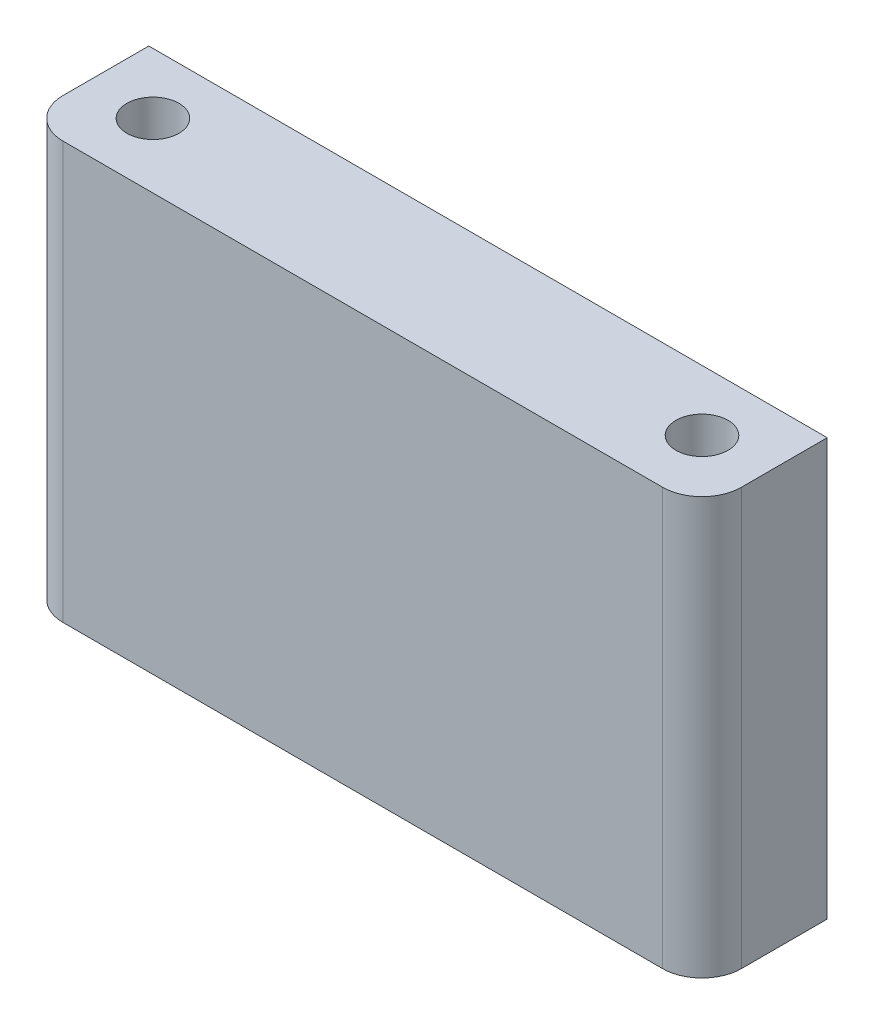
ISO-10303-21;
HEADER;
FILE_DESCRIPTION(('STEP AP214'),'2;1');
FILE_NAME('part.step','',(''),(''),'','','');
FILE_SCHEMA(('AUTOMOTIVE_DESIGN { 1 0 10303 214 1 1 1 1 }'));
ENDSEC;
DATA;
#1=APPLICATION_CONTEXT('core data for automotive mechanical design processes');
#2=APPLICATION_PROTOCOL_DEFINITION('international standard','automotive_design',2000,#1);
#3=PRODUCT_CONTEXT('',#1,'mechanical');
#4=PRODUCT('Part','Part','',(#3));
#5=PRODUCT_RELATED_PRODUCT_CATEGORY('part','',(#4));
#6=PRODUCT_DEFINITION_FORMATION('','',#4);
#7=PRODUCT_DEFINITION_CONTEXT('part definition',#1,'design');
#8=PRODUCT_DEFINITION('design','',#6,#7);
#9=PRODUCT_DEFINITION_SHAPE('','',#8);
#10=(LENGTH_UNIT() NAMED_UNIT(*) SI_UNIT(.MILLI.,.METRE.));
#11=(NAMED_UNIT(*) PLANE_ANGLE_UNIT() SI_UNIT($,.RADIAN.));
#12=(NAMED_UNIT(*) SI_UNIT($,.STERADIAN.) SOLID_ANGLE_UNIT());
#13=UNCERTAINTY_MEASURE_WITH_UNIT(LENGTH_MEASURE(1.E-05),#10,'distance_accuracy_value','');
#14=(GEOMETRIC_REPRESENTATION_CONTEXT(3) GLOBAL_UNCERTAINTY_ASSIGNED_CONTEXT((#13)) GLOBAL_UNIT_ASSIGNED_CONTEXT((#10,
#11,#12)) REPRESENTATION_CONTEXT('',''));
#15=CARTESIAN_POINT('',(0.,0.,0.));
#16=DIRECTION('',(0.,0.,1.));
#17=DIRECTION('',(1.,0.,0.));
#18=AXIS2_PLACEMENT_3D('',#15,#16,#17);
#19=CARTESIAN_POINT('',(0.,0.,35.0625));
#20=DIRECTION('',(0.,1.,0.));
#21=DIRECTION('',(1.,0.,0.));
#22=AXIS2_PLACEMENT_3D('',#19,#20,#21);
#23=PLANE('',#22);
#24=CARTESIAN_POINT('',(34.8,0.,34.8));
#25=DIRECTION('',(0.,-1.,0.));
#26=DIRECTION('',(1.,0.,0.));
#27=AXIS2_PLACEMENT_3D('',#24,#25,#26);
#28=CIRCLE('',#27,3.3);
#29=CARTESIAN_POINT('',(31.5,0.,34.8));
#30=VERTEX_POINT('',#29);
#31=EDGE_CURVE('E177',#30,#30,#28,.T.);
#32=ORIENTED_EDGE('',*,*,#31,.F.);
#33=EDGE_LOOP('',(#32));
#34=FACE_BOUND('',#33,.T.);
#35=CARTESIAN_POINT('',(-34.8,0.,34.8));
#36=DIRECTION('',(0.,-1.,0.));
#37=DIRECTION('',(1.,0.,0.));
#38=AXIS2_PLACEMENT_3D('',#35,#36,#37);
#39=CIRCLE('',#38,3.3);
#40=CARTESIAN_POINT('',(-38.1,0.,34.8));
#41=VERTEX_POINT('',#40);
#42=EDGE_CURVE('E194',#41,#41,#39,.T.);
#43=ORIENTED_EDGE('',*,*,#42,.F.);
#44=EDGE_LOOP('',(#43));
#45=FACE_BOUND('',#44,.T.);
#46=CARTESIAN_POINT('',(-38.,0.,38.));
#47=DIRECTION('',(0.,1.,0.));
#48=DIRECTION('',(-1.,0.,0.));
#49=AXIS2_PLACEMENT_3D('',#46,#47,#48);
#50=CIRCLE('',#49,5.);
#51=CARTESIAN_POINT('',(-43.,0.,38.));
#52=VERTEX_POINT('',#51);
#53=CARTESIAN_POINT('',(-38.,0.,43.));
#54=VERTEX_POINT('',#53);
#55=EDGE_CURVE('E30',#52,#54,#50,.T.);
#56=ORIENTED_EDGE('',*,*,#55,.F.);
#57=DIRECTION('',(0.,0.,-1.));
#58=VECTOR('',#57,1.);
#59=CARTESIAN_POINT('',(-43.,0.,38.));
#60=LINE('',#59,#58);
#61=CARTESIAN_POINT('',(-43.,0.,27.125));
#62=VERTEX_POINT('',#61);
#63=EDGE_CURVE('E193',#52,#62,#60,.T.);
#64=ORIENTED_EDGE('',*,*,#63,.T.);
#65=DIRECTION('',(1.,0.,0.));
#66=VECTOR('',#65,1.);
#67=CARTESIAN_POINT('',(24.4230296032249,0.,27.125));
#68=LINE('',#67,#66);
#69=CARTESIAN_POINT('',(43.,0.,27.125));
#70=VERTEX_POINT('',#69);
#71=EDGE_CURVE('E131',#62,#70,#68,.T.);
#72=ORIENTED_EDGE('',*,*,#71,.T.);
#73=DIRECTION('',(0.,0.,1.));
#74=VECTOR('',#73,1.);
#75=CARTESIAN_POINT('',(43.,0.,27.125));
#76=LINE('',#75,#74);
#77=CARTESIAN_POINT('',(43.,0.,38.));
#78=VERTEX_POINT('',#77);
#79=EDGE_CURVE('E111',#70,#78,#76,.T.);
#80=ORIENTED_EDGE('',*,*,#79,.T.);
#81=CARTESIAN_POINT('',(38.,0.,38.));
#82=DIRECTION('',(0.,1.,0.));
#83=DIRECTION('',(0.,0.,1.));
#84=AXIS2_PLACEMENT_3D('',#81,#82,#83);
#85=CIRCLE('',#84,5.);
#86=CARTESIAN_POINT('',(38.,0.,43.));
#87=VERTEX_POINT('',#86);
#88=EDGE_CURVE('E97',#87,#78,#85,.T.);
#89=ORIENTED_EDGE('',*,*,#88,.F.);
#90=DIRECTION('',(-1.,0.,0.));
#91=VECTOR('',#90,1.);
#92=CARTESIAN_POINT('',(38.,0.,43.));
#93=LINE('',#92,#91);
#94=EDGE_CURVE('E138',#87,#54,#93,.T.);
#95=ORIENTED_EDGE('',*,*,#94,.T.);
#96=EDGE_LOOP('',(#56,#64,#72,#80,#89,#95));
#97=FACE_BOUND('',#96,.T.);
#98=ADVANCED_FACE('F17',(#34,#45,#97),#23,.F.);
#99=CARTESIAN_POINT('',(0.,52.846,35.0625));
#100=DIRECTION('',(0.,1.,0.));
#101=DIRECTION('',(1.,0.,0.));
#102=AXIS2_PLACEMENT_3D('',#99,#100,#101);
#103=PLANE('',#102);
#104=CARTESIAN_POINT('',(34.8,52.846,34.8));
#105=DIRECTION('',(0.,-1.,0.));
#106=DIRECTION('',(1.,0.,0.));
#107=AXIS2_PLACEMENT_3D('',#104,#105,#106);
#108=CIRCLE('',#107,3.3);
#109=CARTESIAN_POINT('',(31.5,52.846,34.8));
#110=VERTEX_POINT('',#109);
#111=EDGE_CURVE('E171',#110,#110,#108,.T.);
#112=ORIENTED_EDGE('',*,*,#111,.T.);
#113=EDGE_LOOP('',(#112));
#114=FACE_BOUND('',#113,.T.);
#115=CARTESIAN_POINT('',(-34.8,52.846,34.8));
#116=DIRECTION('',(0.,-1.,0.));
#117=DIRECTION('',(1.,0.,0.));
#118=AXIS2_PLACEMENT_3D('',#115,#116,#117);
#119=CIRCLE('',#118,3.3);
#120=CARTESIAN_POINT('',(-38.1,52.846,34.8));
#121=VERTEX_POINT('',#120);
#122=EDGE_CURVE('E183',#121,#121,#119,.T.);
#123=ORIENTED_EDGE('',*,*,#122,.T.);
#124=EDGE_LOOP('',(#123));
#125=FACE_BOUND('',#124,.T.);
#126=CARTESIAN_POINT('',(-38.,52.846,38.));
#127=DIRECTION('',(0.,1.,0.));
#128=DIRECTION('',(-1.,0.,0.));
#129=AXIS2_PLACEMENT_3D('',#126,#127,#128);
#130=CIRCLE('',#129,5.);
#131=CARTESIAN_POINT('',(-43.,52.846,38.));
#132=VERTEX_POINT('',#131);
#133=CARTESIAN_POINT('',(-38.,52.846,43.));
#134=VERTEX_POINT('',#133);
#135=EDGE_CURVE('E11',#132,#134,#130,.T.);
#136=ORIENTED_EDGE('',*,*,#135,.T.);
#137=DIRECTION('',(1.,0.,0.));
#138=VECTOR('',#137,1.);
#139=CARTESIAN_POINT('',(38.,52.846,43.));
#140=LINE('',#139,#138);
#141=CARTESIAN_POINT('',(38.,52.846,43.));
#142=VERTEX_POINT('',#141);
#143=EDGE_CURVE('E91',#134,#142,#140,.T.);
#144=ORIENTED_EDGE('',*,*,#143,.T.);
#145=CARTESIAN_POINT('',(38.,52.846,38.));
#146=DIRECTION('',(0.,1.,0.));
#147=DIRECTION('',(0.,0.,1.));
#148=AXIS2_PLACEMENT_3D('',#145,#146,#147);
#149=CIRCLE('',#148,5.);
#150=CARTESIAN_POINT('',(43.,52.846,38.));
#151=VERTEX_POINT('',#150);
#152=EDGE_CURVE('E87',#142,#151,#149,.T.);
#153=ORIENTED_EDGE('',*,*,#152,.T.);
#154=DIRECTION('',(0.,0.,-1.));
#155=VECTOR('',#154,1.);
#156=CARTESIAN_POINT('',(43.,52.846,27.125));
#157=LINE('',#156,#155);
#158=CARTESIAN_POINT('',(43.,52.846,27.125));
#159=VERTEX_POINT('',#158);
#160=EDGE_CURVE('E89',#151,#159,#157,.T.);
#161=ORIENTED_EDGE('',*,*,#160,.T.);
#162=DIRECTION('',(-1.,0.,0.));
#163=VECTOR('',#162,1.);
#164=CARTESIAN_POINT('',(24.4230296032249,52.846,27.125));
#165=LINE('',#164,#163);
#166=CARTESIAN_POINT('',(-43.,52.846,27.125));
#167=VERTEX_POINT('',#166);
#168=EDGE_CURVE('E132',#159,#167,#165,.T.);
#169=ORIENTED_EDGE('',*,*,#168,.T.);
#170=DIRECTION('',(0.,0.,1.));
#171=VECTOR('',#170,1.);
#172=CARTESIAN_POINT('',(-43.,52.846,38.));
#173=LINE('',#172,#171);
#174=EDGE_CURVE('E124',#167,#132,#173,.T.);
#175=ORIENTED_EDGE('',*,*,#174,.T.);
#176=EDGE_LOOP('',(#136,#144,#153,#161,#169,#175));
#177=FACE_BOUND('',#176,.T.);
#178=ADVANCED_FACE('F19',(#114,#125,#177),#103,.T.);
#179=CARTESIAN_POINT('',(-38.,0.,38.));
#180=DIRECTION('',(0.,1.,0.));
#181=DIRECTION('',(-1.,0.,0.));
#182=AXIS2_PLACEMENT_3D('',#179,#180,#181);
#183=CYLINDRICAL_SURFACE('',#182,5.);
#184=ORIENTED_EDGE('',*,*,#55,.T.);
#185=DIRECTION('',(0.,1.,0.));
#186=VECTOR('',#185,1.);
#187=CARTESIAN_POINT('',(-38.,0.,43.));
#188=LINE('',#187,#186);
#189=EDGE_CURVE('E148',#54,#134,#188,.T.);
#190=ORIENTED_EDGE('',*,*,#189,.T.);
#191=ORIENTED_EDGE('',*,*,#135,.F.);
#192=DIRECTION('',(0.,1.,0.));
#193=VECTOR('',#192,1.);
#194=CARTESIAN_POINT('',(-43.,0.,38.));
#195=LINE('',#194,#193);
#196=EDGE_CURVE('E123',#52,#132,#195,.T.);
#197=ORIENTED_EDGE('',*,*,#196,.F.);
#198=EDGE_LOOP('',(#184,#190,#191,#197));
#199=FACE_BOUND('',#198,.T.);
#200=ADVANCED_FACE('F154',(#199),#183,.T.);
#201=CARTESIAN_POINT('',(-38.,0.,43.));
#202=DIRECTION('',(0.,0.,1.));
#203=DIRECTION('',(1.,0.,0.));
#204=AXIS2_PLACEMENT_3D('',#201,#202,#203);
#205=PLANE('',#204);
#206=ORIENTED_EDGE('',*,*,#94,.F.);
#207=DIRECTION('',(0.,1.,0.));
#208=VECTOR('',#207,1.);
#209=CARTESIAN_POINT('',(38.,0.,43.));
#210=LINE('',#209,#208);
#211=EDGE_CURVE('E98',#87,#142,#210,.T.);
#212=ORIENTED_EDGE('',*,*,#211,.T.);
#213=ORIENTED_EDGE('',*,*,#143,.F.);
#214=ORIENTED_EDGE('',*,*,#189,.F.);
#215=EDGE_LOOP('',(#206,#212,#213,#214));
#216=FACE_BOUND('',#215,.T.);
#217=ADVANCED_FACE('F161',(#216),#205,.T.);
#218=CARTESIAN_POINT('',(38.,0.,38.));
#219=DIRECTION('',(0.,1.,0.));
#220=DIRECTION('',(0.,0.,1.));
#221=AXIS2_PLACEMENT_3D('',#218,#219,#220);
#222=CYLINDRICAL_SURFACE('',#221,5.);
#223=ORIENTED_EDGE('',*,*,#88,.T.);
#224=DIRECTION('',(0.,1.,0.));
#225=VECTOR('',#224,1.);
#226=CARTESIAN_POINT('',(43.,0.,38.));
#227=LINE('',#226,#225);
#228=EDGE_CURVE('E105',#78,#151,#227,.T.);
#229=ORIENTED_EDGE('',*,*,#228,.T.);
#230=ORIENTED_EDGE('',*,*,#152,.F.);
#231=ORIENTED_EDGE('',*,*,#211,.F.);
#232=EDGE_LOOP('',(#223,#229,#230,#231));
#233=FACE_BOUND('',#232,.T.);
#234=ADVANCED_FACE('F103',(#233),#222,.T.);
#235=CARTESIAN_POINT('',(43.,0.,38.));
#236=DIRECTION('',(1.,0.,0.));
#237=DIRECTION('',(0.,1.,0.));
#238=AXIS2_PLACEMENT_3D('',#235,#236,#237);
#239=PLANE('',#238);
#240=ORIENTED_EDGE('',*,*,#79,.F.);
#241=DIRECTION('',(0.,1.,0.));
#242=VECTOR('',#241,1.);
#243=CARTESIAN_POINT('',(43.,0.,27.125));
#244=LINE('',#243,#242);
#245=EDGE_CURVE('E112',#70,#159,#244,.T.);
#246=ORIENTED_EDGE('',*,*,#245,.T.);
#247=ORIENTED_EDGE('',*,*,#160,.F.);
#248=ORIENTED_EDGE('',*,*,#228,.F.);
#249=EDGE_LOOP('',(#240,#246,#247,#248));
#250=FACE_BOUND('',#249,.T.);
#251=ADVANCED_FACE('F108',(#250),#239,.T.);
#252=CARTESIAN_POINT('',(43.,0.,27.125));
#253=DIRECTION('',(0.,0.,-1.));
#254=DIRECTION('',(0.,-1.,0.));
#255=AXIS2_PLACEMENT_3D('',#252,#253,#254);
#256=PLANE('',#255);
#257=ORIENTED_EDGE('',*,*,#71,.F.);
#258=DIRECTION('',(0.,1.,0.));
#259=VECTOR('',#258,1.);
#260=CARTESIAN_POINT('',(-43.,0.,27.125));
#261=LINE('',#260,#259);
#262=EDGE_CURVE('E126',#62,#167,#261,.T.);
#263=ORIENTED_EDGE('',*,*,#262,.T.);
#264=ORIENTED_EDGE('',*,*,#168,.F.);
#265=ORIENTED_EDGE('',*,*,#245,.F.);
#266=EDGE_LOOP('',(#257,#263,#264,#265));
#267=FACE_BOUND('',#266,.T.);
#268=ADVANCED_FACE('F163',(#267),#256,.T.);
#269=CARTESIAN_POINT('',(-43.,0.,27.125));
#270=DIRECTION('',(-1.,0.,0.));
#271=DIRECTION('',(0.,0.,1.));
#272=AXIS2_PLACEMENT_3D('',#269,#270,#271);
#273=PLANE('',#272);
#274=ORIENTED_EDGE('',*,*,#63,.F.);
#275=ORIENTED_EDGE('',*,*,#196,.T.);
#276=ORIENTED_EDGE('',*,*,#174,.F.);
#277=ORIENTED_EDGE('',*,*,#262,.F.);
#278=EDGE_LOOP('',(#274,#275,#276,#277));
#279=FACE_BOUND('',#278,.T.);
#280=ADVANCED_FACE('F204',(#279),#273,.T.);
#281=CARTESIAN_POINT('',(-34.8,0.,34.8));
#282=DIRECTION('',(0.,1.,0.));
#283=DIRECTION('',(1.,0.,0.));
#284=AXIS2_PLACEMENT_3D('',#281,#282,#283);
#285=CYLINDRICAL_SURFACE('',#284,3.3);
#286=ORIENTED_EDGE('',*,*,#122,.F.);
#287=DIRECTION('',(0.,-1.,0.));
#288=VECTOR('',#287,1.);
#289=CARTESIAN_POINT('',(-38.1,0.,34.8));
#290=LINE('',#289,#288);
#291=EDGE_CURVE('E190',#121,#41,#290,.T.);
#292=ORIENTED_EDGE('',*,*,#291,.T.);
#293=ORIENTED_EDGE('',*,*,#42,.T.);
#294=ORIENTED_EDGE('',*,*,#291,.F.);
#295=EDGE_LOOP('',(#286,#292,#293,#294));
#296=FACE_BOUND('',#295,.T.);
#297=ADVANCED_FACE('F221',(#296),#285,.F.);
#298=CARTESIAN_POINT('',(34.8,0.,34.8));
#299=DIRECTION('',(0.,1.,0.));
#300=DIRECTION('',(1.,0.,0.));
#301=AXIS2_PLACEMENT_3D('',#298,#299,#300);
#302=CYLINDRICAL_SURFACE('',#301,3.3);
#303=ORIENTED_EDGE('',*,*,#111,.F.);
#304=DIRECTION('',(0.,-1.,0.));
#305=VECTOR('',#304,1.);
#306=CARTESIAN_POINT('',(31.5,0.,34.8));
#307=LINE('',#306,#305);
#308=EDGE_CURVE('E175',#110,#30,#307,.T.);
#309=ORIENTED_EDGE('',*,*,#308,.T.);
#310=ORIENTED_EDGE('',*,*,#31,.T.);
#311=ORIENTED_EDGE('',*,*,#308,.F.);
#312=EDGE_LOOP('',(#303,#309,#310,#311));
#313=FACE_BOUND('',#312,.T.);
#314=ADVANCED_FACE('F220',(#313),#302,.F.);
#315=CLOSED_SHELL('',(#98,#178,#200,#217,#234,#251,#268,#280,#297,#314));
#316=MANIFOLD_SOLID_BREP('B1',#315);
#317=ADVANCED_BREP_SHAPE_REPRESENTATION('',(#18,#316),#14);
#318=SHAPE_DEFINITION_REPRESENTATION(#9,#317);
ENDSEC;
END-ISO-10303-21;
